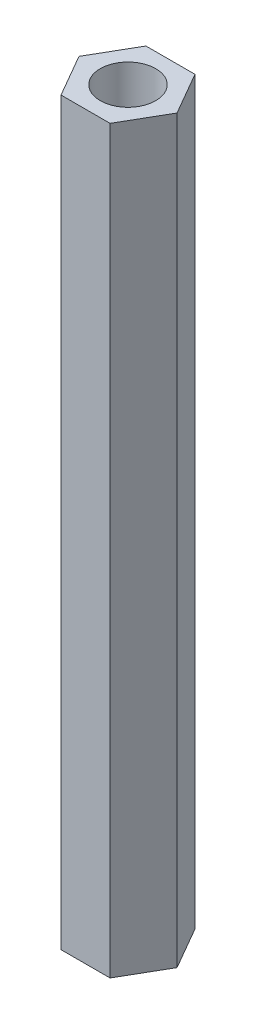
ISO-10303-21;
HEADER;
FILE_DESCRIPTION(('STEP AP214'),'2;1');
FILE_NAME('part.step','',(''),(''),'','','');
FILE_SCHEMA(('AUTOMOTIVE_DESIGN { 1 0 10303 214 1 1 1 1 }'));
ENDSEC;
DATA;
#1=APPLICATION_CONTEXT('core data for automotive mechanical design processes');
#2=APPLICATION_PROTOCOL_DEFINITION('international standard','automotive_design',2000,#1);
#3=PRODUCT_CONTEXT('',#1,'mechanical');
#4=PRODUCT('Part','Part','',(#3));
#5=PRODUCT_RELATED_PRODUCT_CATEGORY('part','',(#4));
#6=PRODUCT_DEFINITION_FORMATION('','',#4);
#7=PRODUCT_DEFINITION_CONTEXT('part definition',#1,'design');
#8=PRODUCT_DEFINITION('design','',#6,#7);
#9=PRODUCT_DEFINITION_SHAPE('','',#8);
#10=(LENGTH_UNIT() NAMED_UNIT(*) SI_UNIT(.MILLI.,.METRE.));
#11=(NAMED_UNIT(*) PLANE_ANGLE_UNIT() SI_UNIT($,.RADIAN.));
#12=(NAMED_UNIT(*) SI_UNIT($,.STERADIAN.) SOLID_ANGLE_UNIT());
#13=UNCERTAINTY_MEASURE_WITH_UNIT(LENGTH_MEASURE(1.E-05),#10,'distance_accuracy_value','');
#14=(GEOMETRIC_REPRESENTATION_CONTEXT(3) GLOBAL_UNCERTAINTY_ASSIGNED_CONTEXT((#13)) GLOBAL_UNIT_ASSIGNED_CONTEXT((#10,
#11,#12)) REPRESENTATION_CONTEXT('',''));
#15=CARTESIAN_POINT('',(0.,0.,0.));
#16=DIRECTION('',(0.,0.,1.));
#17=DIRECTION('',(1.,0.,0.));
#18=AXIS2_PLACEMENT_3D('',#15,#16,#17);
#19=CARTESIAN_POINT('',(1.32501886779019,40.,2.295));
#20=DIRECTION('',(-0.866025403784439,0.,-0.5));
#21=DIRECTION('',(-0.5,0.,0.866025403784439));
#22=AXIS2_PLACEMENT_3D('',#19,#20,#21);
#23=PLANE('',#22);
#24=DIRECTION('',(0.5,0.,-0.866025403784439));
#25=VECTOR('',#24,1.);
#26=CARTESIAN_POINT('',(1.32501886779019,0.,2.295));
#27=LINE('',#26,#25);
#28=CARTESIAN_POINT('',(1.32501886779019,0.,2.295));
#29=VERTEX_POINT('',#28);
#30=CARTESIAN_POINT('',(2.65003773558038,0.,0.));
#31=VERTEX_POINT('',#30);
#32=EDGE_CURVE('E118',#29,#31,#27,.T.);
#33=ORIENTED_EDGE('',*,*,#32,.T.);
#34=DIRECTION('',(0.,-1.,0.));
#35=VECTOR('',#34,1.);
#36=CARTESIAN_POINT('',(2.65003773558038,40.,0.));
#37=LINE('',#36,#35);
#38=CARTESIAN_POINT('',(2.65003773558038,40.,0.));
#39=VERTEX_POINT('',#38);
#40=EDGE_CURVE('E11',#39,#31,#37,.T.);
#41=ORIENTED_EDGE('',*,*,#40,.F.);
#42=DIRECTION('',(0.5,0.,-0.866025403784439));
#43=VECTOR('',#42,1.);
#44=CARTESIAN_POINT('',(1.32501886779019,40.,2.295));
#45=LINE('',#44,#43);
#46=CARTESIAN_POINT('',(1.32501886779019,40.,2.295));
#47=VERTEX_POINT('',#46);
#48=EDGE_CURVE('E129',#47,#39,#45,.T.);
#49=ORIENTED_EDGE('',*,*,#48,.F.);
#50=DIRECTION('',(0.,-1.,0.));
#51=VECTOR('',#50,1.);
#52=CARTESIAN_POINT('',(1.32501886779019,40.,2.295));
#53=LINE('',#52,#51);
#54=EDGE_CURVE('E114',#47,#29,#53,.T.);
#55=ORIENTED_EDGE('',*,*,#54,.T.);
#56=EDGE_LOOP('',(#33,#41,#49,#55));
#57=FACE_BOUND('',#56,.T.);
#58=ADVANCED_FACE('F34',(#57),#23,.F.);
#59=CARTESIAN_POINT('',(2.65003773558038,40.,0.));
#60=DIRECTION('',(-0.866025403784439,0.,0.5));
#61=DIRECTION('',(0.5,0.,0.866025403784439));
#62=AXIS2_PLACEMENT_3D('',#59,#60,#61);
#63=PLANE('',#62);
#64=DIRECTION('',(-0.5,0.,-0.866025403784439));
#65=VECTOR('',#64,1.);
#66=CARTESIAN_POINT('',(2.65003773558038,0.,0.));
#67=LINE('',#66,#65);
#68=CARTESIAN_POINT('',(1.32501886779019,0.,-2.295));
#69=VERTEX_POINT('',#68);
#70=EDGE_CURVE('E121',#31,#69,#67,.T.);
#71=ORIENTED_EDGE('',*,*,#70,.T.);
#72=DIRECTION('',(0.,-1.,0.));
#73=VECTOR('',#72,1.);
#74=CARTESIAN_POINT('',(1.32501886779019,40.,-2.295));
#75=LINE('',#74,#73);
#76=CARTESIAN_POINT('',(1.32501886779019,40.,-2.295));
#77=VERTEX_POINT('',#76);
#78=EDGE_CURVE('E42',#77,#69,#75,.T.);
#79=ORIENTED_EDGE('',*,*,#78,.F.);
#80=DIRECTION('',(-0.5,0.,-0.866025403784439));
#81=VECTOR('',#80,1.);
#82=CARTESIAN_POINT('',(2.65003773558038,40.,0.));
#83=LINE('',#82,#81);
#84=EDGE_CURVE('E87',#39,#77,#83,.T.);
#85=ORIENTED_EDGE('',*,*,#84,.F.);
#86=ORIENTED_EDGE('',*,*,#40,.T.);
#87=EDGE_LOOP('',(#71,#79,#85,#86));
#88=FACE_BOUND('',#87,.T.);
#89=ADVANCED_FACE('F154',(#88),#63,.F.);
#90=CARTESIAN_POINT('',(1.32501886779019,40.,-2.295));
#91=DIRECTION('',(0.,0.,1.));
#92=DIRECTION('',(1.,0.,0.));
#93=AXIS2_PLACEMENT_3D('',#90,#91,#92);
#94=PLANE('',#93);
#95=DIRECTION('',(-1.,0.,0.));
#96=VECTOR('',#95,1.);
#97=CARTESIAN_POINT('',(1.32501886779019,0.,-2.295));
#98=LINE('',#97,#96);
#99=CARTESIAN_POINT('',(-1.32501886779019,0.,-2.295));
#100=VERTEX_POINT('',#99);
#101=EDGE_CURVE('E124',#69,#100,#98,.T.);
#102=ORIENTED_EDGE('',*,*,#101,.T.);
#103=DIRECTION('',(0.,-1.,0.));
#104=VECTOR('',#103,1.);
#105=CARTESIAN_POINT('',(-1.32501886779019,40.,-2.295));
#106=LINE('',#105,#104);
#107=CARTESIAN_POINT('',(-1.32501886779019,40.,-2.295));
#108=VERTEX_POINT('',#107);
#109=EDGE_CURVE('E109',#108,#100,#106,.T.);
#110=ORIENTED_EDGE('',*,*,#109,.F.);
#111=DIRECTION('',(-1.,0.,0.));
#112=VECTOR('',#111,1.);
#113=CARTESIAN_POINT('',(1.32501886779019,40.,-2.295));
#114=LINE('',#113,#112);
#115=EDGE_CURVE('E100',#77,#108,#114,.T.);
#116=ORIENTED_EDGE('',*,*,#115,.F.);
#117=ORIENTED_EDGE('',*,*,#78,.T.);
#118=EDGE_LOOP('',(#102,#110,#116,#117));
#119=FACE_BOUND('',#118,.T.);
#120=ADVANCED_FACE('F135',(#119),#94,.F.);
#121=CARTESIAN_POINT('',(-1.32501886779019,40.,-2.295));
#122=DIRECTION('',(0.866025403784439,0.,0.5));
#123=DIRECTION('',(0.5,0.,-0.866025403784439));
#124=AXIS2_PLACEMENT_3D('',#121,#122,#123);
#125=PLANE('',#124);
#126=DIRECTION('',(-0.5,0.,0.866025403784439));
#127=VECTOR('',#126,1.);
#128=CARTESIAN_POINT('',(-1.32501886779019,0.,-2.295));
#129=LINE('',#128,#127);
#130=CARTESIAN_POINT('',(-2.65003773558038,0.,0.));
#131=VERTEX_POINT('',#130);
#132=EDGE_CURVE('E108',#100,#131,#129,.T.);
#133=ORIENTED_EDGE('',*,*,#132,.T.);
#134=DIRECTION('',(0.,-1.,0.));
#135=VECTOR('',#134,1.);
#136=CARTESIAN_POINT('',(-2.65003773558038,40.,0.));
#137=LINE('',#136,#135);
#138=CARTESIAN_POINT('',(-2.65003773558038,40.,0.));
#139=VERTEX_POINT('',#138);
#140=EDGE_CURVE('E105',#139,#131,#137,.T.);
#141=ORIENTED_EDGE('',*,*,#140,.F.);
#142=DIRECTION('',(-0.5,0.,0.866025403784439));
#143=VECTOR('',#142,1.);
#144=CARTESIAN_POINT('',(-1.32501886779019,40.,-2.295));
#145=LINE('',#144,#143);
#146=EDGE_CURVE('E94',#108,#139,#145,.T.);
#147=ORIENTED_EDGE('',*,*,#146,.F.);
#148=ORIENTED_EDGE('',*,*,#109,.T.);
#149=EDGE_LOOP('',(#133,#141,#147,#148));
#150=FACE_BOUND('',#149,.T.);
#151=ADVANCED_FACE('F106',(#150),#125,.F.);
#152=CARTESIAN_POINT('',(-2.65003773558038,40.,0.));
#153=DIRECTION('',(0.866025403784439,0.,-0.5));
#154=DIRECTION('',(-0.5,0.,-0.866025403784439));
#155=AXIS2_PLACEMENT_3D('',#152,#153,#154);
#156=PLANE('',#155);
#157=DIRECTION('',(0.5,0.,0.866025403784439));
#158=VECTOR('',#157,1.);
#159=CARTESIAN_POINT('',(-2.65003773558038,0.,0.));
#160=LINE('',#159,#158);
#161=CARTESIAN_POINT('',(-1.32501886779019,0.,2.295));
#162=VERTEX_POINT('',#161);
#163=EDGE_CURVE('E73',#131,#162,#160,.T.);
#164=ORIENTED_EDGE('',*,*,#163,.T.);
#165=DIRECTION('',(0.,-1.,0.));
#166=VECTOR('',#165,1.);
#167=CARTESIAN_POINT('',(-1.32501886779019,40.,2.295));
#168=LINE('',#167,#166);
#169=CARTESIAN_POINT('',(-1.32501886779019,40.,2.295));
#170=VERTEX_POINT('',#169);
#171=EDGE_CURVE('E110',#170,#162,#168,.T.);
#172=ORIENTED_EDGE('',*,*,#171,.F.);
#173=DIRECTION('',(0.5,0.,0.866025403784439));
#174=VECTOR('',#173,1.);
#175=CARTESIAN_POINT('',(-2.65003773558038,40.,0.));
#176=LINE('',#175,#174);
#177=EDGE_CURVE('E98',#139,#170,#176,.T.);
#178=ORIENTED_EDGE('',*,*,#177,.F.);
#179=ORIENTED_EDGE('',*,*,#140,.T.);
#180=EDGE_LOOP('',(#164,#172,#178,#179));
#181=FACE_BOUND('',#180,.T.);
#182=ADVANCED_FACE('F112',(#181),#156,.F.);
#183=CARTESIAN_POINT('',(-1.32501886779019,40.,2.295));
#184=DIRECTION('',(0.,0.,-1.));
#185=DIRECTION('',(-1.,0.,0.));
#186=AXIS2_PLACEMENT_3D('',#183,#184,#185);
#187=PLANE('',#186);
#188=DIRECTION('',(1.,0.,0.));
#189=VECTOR('',#188,1.);
#190=CARTESIAN_POINT('',(-1.32501886779019,0.,2.295));
#191=LINE('',#190,#189);
#192=EDGE_CURVE('E79',#162,#29,#191,.T.);
#193=ORIENTED_EDGE('',*,*,#192,.T.);
#194=ORIENTED_EDGE('',*,*,#54,.F.);
#195=DIRECTION('',(1.,0.,0.));
#196=VECTOR('',#195,1.);
#197=CARTESIAN_POINT('',(-1.32501886779019,40.,2.295));
#198=LINE('',#197,#196);
#199=EDGE_CURVE('E50',#170,#47,#198,.T.);
#200=ORIENTED_EDGE('',*,*,#199,.F.);
#201=ORIENTED_EDGE('',*,*,#171,.T.);
#202=EDGE_LOOP('',(#193,#194,#200,#201));
#203=FACE_BOUND('',#202,.T.);
#204=ADVANCED_FACE('F142',(#203),#187,.F.);
#205=CARTESIAN_POINT('',(0.,40.,0.));
#206=DIRECTION('',(0.,1.,0.));
#207=DIRECTION('',(0.,0.,1.));
#208=AXIS2_PLACEMENT_3D('',#205,#206,#207);
#209=PLANE('',#208);
#210=CARTESIAN_POINT('',(0.,40.,0.));
#211=DIRECTION('',(0.,1.,0.));
#212=DIRECTION('',(0.,0.,1.));
#213=AXIS2_PLACEMENT_3D('',#210,#211,#212);
#214=CIRCLE('',#213,1.5);
#215=CARTESIAN_POINT('',(0.,40.,1.5));
#216=VERTEX_POINT('',#215);
#217=EDGE_CURVE('E209',#216,#216,#214,.T.);
#218=ORIENTED_EDGE('',*,*,#217,.F.);
#219=EDGE_LOOP('',(#218));
#220=FACE_BOUND('',#219,.T.);
#221=ORIENTED_EDGE('',*,*,#48,.T.);
#222=ORIENTED_EDGE('',*,*,#84,.T.);
#223=ORIENTED_EDGE('',*,*,#115,.T.);
#224=ORIENTED_EDGE('',*,*,#146,.T.);
#225=ORIENTED_EDGE('',*,*,#177,.T.);
#226=ORIENTED_EDGE('',*,*,#199,.T.);
#227=EDGE_LOOP('',(#221,#222,#223,#224,#225,#226));
#228=FACE_BOUND('',#227,.T.);
#229=ADVANCED_FACE('F96',(#220,#228),#209,.T.);
#230=CARTESIAN_POINT('',(0.,0.,0.));
#231=DIRECTION('',(0.,1.,0.));
#232=DIRECTION('',(0.,0.,1.));
#233=AXIS2_PLACEMENT_3D('',#230,#231,#232);
#234=PLANE('',#233);
#235=CARTESIAN_POINT('',(0.,0.,0.));
#236=DIRECTION('',(0.,1.,0.));
#237=DIRECTION('',(0.,0.,1.));
#238=AXIS2_PLACEMENT_3D('',#235,#236,#237);
#239=CIRCLE('',#238,1.5);
#240=CARTESIAN_POINT('',(0.,0.,1.5));
#241=VERTEX_POINT('',#240);
#242=EDGE_CURVE('E122',#241,#241,#239,.T.);
#243=ORIENTED_EDGE('',*,*,#242,.T.);
#244=EDGE_LOOP('',(#243));
#245=FACE_BOUND('',#244,.T.);
#246=ORIENTED_EDGE('',*,*,#32,.F.);
#247=ORIENTED_EDGE('',*,*,#192,.F.);
#248=ORIENTED_EDGE('',*,*,#163,.F.);
#249=ORIENTED_EDGE('',*,*,#132,.F.);
#250=ORIENTED_EDGE('',*,*,#101,.F.);
#251=ORIENTED_EDGE('',*,*,#70,.F.);
#252=EDGE_LOOP('',(#246,#247,#248,#249,#250,#251));
#253=FACE_BOUND('',#252,.T.);
#254=ADVANCED_FACE('F138',(#245,#253),#234,.F.);
#255=CARTESIAN_POINT('',(0.,0.,0.));
#256=DIRECTION('',(0.,1.,0.));
#257=DIRECTION('',(0.,0.,1.));
#258=AXIS2_PLACEMENT_3D('',#255,#256,#257);
#259=CYLINDRICAL_SURFACE('',#258,1.5);
#260=ORIENTED_EDGE('',*,*,#242,.F.);
#261=EDGE_LOOP('',(#260));
#262=FACE_BOUND('',#261,.T.);
#263=ORIENTED_EDGE('',*,*,#217,.T.);
#264=EDGE_LOOP('',(#263));
#265=FACE_BOUND('',#264,.T.);
#266=ADVANCED_FACE('F191',(#262,#265),#259,.F.);
#267=CLOSED_SHELL('',(#58,#89,#120,#151,#182,#204,#229,#254,#266));
#268=MANIFOLD_SOLID_BREP('B2',#267);
#269=ADVANCED_BREP_SHAPE_REPRESENTATION('',(#18,#268),#14);
#270=SHAPE_DEFINITION_REPRESENTATION(#9,#269);
ENDSEC;
END-ISO-10303-21;
